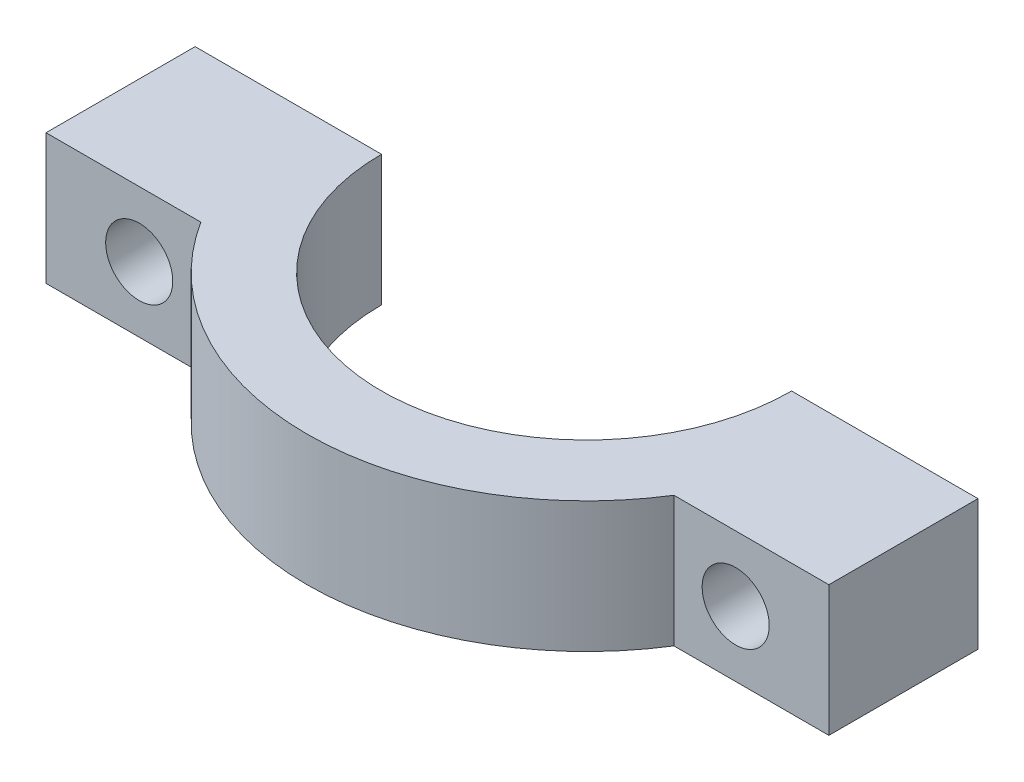
ISO-10303-21;
HEADER;
FILE_DESCRIPTION(('STEP AP214'),'2;1');
FILE_NAME('part.step','',(''),(''),'','','');
FILE_SCHEMA(('AUTOMOTIVE_DESIGN { 1 0 10303 214 1 1 1 1 }'));
ENDSEC;
DATA;
#1=APPLICATION_CONTEXT('core data for automotive mechanical design processes');
#2=APPLICATION_PROTOCOL_DEFINITION('international standard','automotive_design',2000,#1);
#3=PRODUCT_CONTEXT('',#1,'mechanical');
#4=PRODUCT('Part','Part','',(#3));
#5=PRODUCT_RELATED_PRODUCT_CATEGORY('part','',(#4));
#6=PRODUCT_DEFINITION_FORMATION('','',#4);
#7=PRODUCT_DEFINITION_CONTEXT('part definition',#1,'design');
#8=PRODUCT_DEFINITION('design','',#6,#7);
#9=PRODUCT_DEFINITION_SHAPE('','',#8);
#10=(LENGTH_UNIT() NAMED_UNIT(*) SI_UNIT(.MILLI.,.METRE.));
#11=(NAMED_UNIT(*) PLANE_ANGLE_UNIT() SI_UNIT($,.RADIAN.));
#12=(NAMED_UNIT(*) SI_UNIT($,.STERADIAN.) SOLID_ANGLE_UNIT());
#13=UNCERTAINTY_MEASURE_WITH_UNIT(LENGTH_MEASURE(1.E-05),#10,'distance_accuracy_value','');
#14=(GEOMETRIC_REPRESENTATION_CONTEXT(3) GLOBAL_UNCERTAINTY_ASSIGNED_CONTEXT((#13)) GLOBAL_UNIT_ASSIGNED_CONTEXT((#10,
#11,#12)) REPRESENTATION_CONTEXT('',''));
#15=CARTESIAN_POINT('',(0.,0.,0.));
#16=DIRECTION('',(0.,0.,1.));
#17=DIRECTION('',(1.,0.,0.));
#18=AXIS2_PLACEMENT_3D('',#15,#16,#17);
#19=CARTESIAN_POINT('',(0.,7.,0.));
#20=DIRECTION('',(0.,-1.,0.));
#21=DIRECTION('',(0.,0.,-1.));
#22=AXIS2_PLACEMENT_3D('',#19,#20,#21);
#23=CYLINDRICAL_SURFACE('',#22,11.);
#24=CARTESIAN_POINT('',(0.,0.,0.));
#25=DIRECTION('',(0.,-1.,0.));
#26=DIRECTION('',(0.,0.,1.));
#27=AXIS2_PLACEMENT_3D('',#24,#25,#26);
#28=CIRCLE('',#27,11.);
#29=CARTESIAN_POINT('',(11.,0.,0.));
#30=VERTEX_POINT('',#29);
#31=CARTESIAN_POINT('',(-11.,0.,0.));
#32=VERTEX_POINT('',#31);
#33=EDGE_CURVE('E145',#30,#32,#28,.T.);
#34=ORIENTED_EDGE('',*,*,#33,.T.);
#35=DIRECTION('',(0.,-1.,0.));
#36=VECTOR('',#35,1.);
#37=CARTESIAN_POINT('',(-11.,7.,0.));
#38=LINE('',#37,#36);
#39=CARTESIAN_POINT('',(-11.,7.,0.));
#40=VERTEX_POINT('',#39);
#41=EDGE_CURVE('E11',#40,#32,#38,.T.);
#42=ORIENTED_EDGE('',*,*,#41,.F.);
#43=CARTESIAN_POINT('',(0.,7.,0.));
#44=DIRECTION('',(0.,-1.,0.));
#45=DIRECTION('',(0.,0.,1.));
#46=AXIS2_PLACEMENT_3D('',#43,#44,#45);
#47=CIRCLE('',#46,11.);
#48=CARTESIAN_POINT('',(11.,7.,0.));
#49=VERTEX_POINT('',#48);
#50=EDGE_CURVE('E168',#49,#40,#47,.T.);
#51=ORIENTED_EDGE('',*,*,#50,.F.);
#52=DIRECTION('',(0.,-1.,0.));
#53=VECTOR('',#52,1.);
#54=CARTESIAN_POINT('',(11.,7.,0.));
#55=LINE('',#54,#53);
#56=EDGE_CURVE('E141',#49,#30,#55,.T.);
#57=ORIENTED_EDGE('',*,*,#56,.T.);
#58=EDGE_LOOP('',(#34,#42,#51,#57));
#59=FACE_BOUND('',#58,.T.);
#60=ADVANCED_FACE('F43',(#59),#23,.F.);
#61=CARTESIAN_POINT('',(-11.,7.,0.));
#62=DIRECTION('',(0.,0.,1.));
#63=DIRECTION('',(1.,0.,0.));
#64=AXIS2_PLACEMENT_3D('',#61,#62,#63);
#65=PLANE('',#64);
#66=CARTESIAN_POINT('',(-16.,3.5,0.));
#67=DIRECTION('',(0.,0.,1.));
#68=DIRECTION('',(1.,0.,0.));
#69=AXIS2_PLACEMENT_3D('',#66,#67,#68);
#70=CIRCLE('',#69,1.8);
#71=CARTESIAN_POINT('',(-14.2,3.5,0.));
#72=VERTEX_POINT('',#71);
#73=EDGE_CURVE('E220',#72,#72,#70,.T.);
#74=ORIENTED_EDGE('',*,*,#73,.T.);
#75=EDGE_LOOP('',(#74));
#76=FACE_BOUND('',#75,.T.);
#77=DIRECTION('',(-1.,0.,0.));
#78=VECTOR('',#77,1.);
#79=CARTESIAN_POINT('',(-11.,0.,0.));
#80=LINE('',#79,#78);
#81=CARTESIAN_POINT('',(-21.,0.,0.));
#82=VERTEX_POINT('',#81);
#83=EDGE_CURVE('E149',#32,#82,#80,.T.);
#84=ORIENTED_EDGE('',*,*,#83,.T.);
#85=DIRECTION('',(0.,-1.,0.));
#86=VECTOR('',#85,1.);
#87=CARTESIAN_POINT('',(-21.,7.,0.));
#88=LINE('',#87,#86);
#89=CARTESIAN_POINT('',(-21.,7.,0.));
#90=VERTEX_POINT('',#89);
#91=EDGE_CURVE('E53',#90,#82,#88,.T.);
#92=ORIENTED_EDGE('',*,*,#91,.F.);
#93=DIRECTION('',(-1.,0.,0.));
#94=VECTOR('',#93,1.);
#95=CARTESIAN_POINT('',(-11.,7.,0.));
#96=LINE('',#95,#94);
#97=EDGE_CURVE('E104',#40,#90,#96,.T.);
#98=ORIENTED_EDGE('',*,*,#97,.F.);
#99=ORIENTED_EDGE('',*,*,#41,.T.);
#100=EDGE_LOOP('',(#84,#92,#98,#99));
#101=FACE_BOUND('',#100,.T.);
#102=ADVANCED_FACE('F238',(#76,#101),#65,.F.);
#103=CARTESIAN_POINT('',(-21.,7.,0.));
#104=DIRECTION('',(1.,0.,0.));
#105=DIRECTION('',(0.,0.,-1.));
#106=AXIS2_PLACEMENT_3D('',#103,#104,#105);
#107=PLANE('',#106);
#108=DIRECTION('',(0.,0.,1.));
#109=VECTOR('',#108,1.);
#110=CARTESIAN_POINT('',(-21.,0.,0.));
#111=LINE('',#110,#109);
#112=CARTESIAN_POINT('',(-21.,0.,8.));
#113=VERTEX_POINT('',#112);
#114=EDGE_CURVE('E153',#82,#113,#111,.T.);
#115=ORIENTED_EDGE('',*,*,#114,.T.);
#116=DIRECTION('',(0.,-1.,0.));
#117=VECTOR('',#116,1.);
#118=CARTESIAN_POINT('',(-21.,7.,8.));
#119=LINE('',#118,#117);
#120=CARTESIAN_POINT('',(-21.,7.,8.));
#121=VERTEX_POINT('',#120);
#122=EDGE_CURVE('E179',#121,#113,#119,.T.);
#123=ORIENTED_EDGE('',*,*,#122,.F.);
#124=DIRECTION('',(0.,0.,1.));
#125=VECTOR('',#124,1.);
#126=CARTESIAN_POINT('',(-21.,7.,0.));
#127=LINE('',#126,#125);
#128=EDGE_CURVE('E190',#90,#121,#127,.T.);
#129=ORIENTED_EDGE('',*,*,#128,.F.);
#130=ORIENTED_EDGE('',*,*,#91,.T.);
#131=EDGE_LOOP('',(#115,#123,#129,#130));
#132=FACE_BOUND('',#131,.T.);
#133=ADVANCED_FACE('F188',(#132),#107,.F.);
#134=CARTESIAN_POINT('',(-21.,7.,8.));
#135=DIRECTION('',(0.,0.,-1.));
#136=DIRECTION('',(-1.,0.,0.));
#137=AXIS2_PLACEMENT_3D('',#134,#135,#136);
#138=PLANE('',#137);
#139=CARTESIAN_POINT('',(-16.,3.5,8.));
#140=DIRECTION('',(0.,0.,-1.));
#141=DIRECTION('',(-1.,0.,0.));
#142=AXIS2_PLACEMENT_3D('',#139,#140,#141);
#143=CIRCLE('',#142,1.8);
#144=CARTESIAN_POINT('',(-17.8,3.5,8.));
#145=VERTEX_POINT('',#144);
#146=EDGE_CURVE('E46',#145,#145,#143,.F.);
#147=ORIENTED_EDGE('',*,*,#146,.F.);
#148=EDGE_LOOP('',(#147));
#149=FACE_BOUND('',#148,.T.);
#150=DIRECTION('',(1.,0.,0.));
#151=VECTOR('',#150,1.);
#152=CARTESIAN_POINT('',(-21.,0.,8.));
#153=LINE('',#152,#151);
#154=CARTESIAN_POINT('',(-12.6885775404495,0.,8.));
#155=VERTEX_POINT('',#154);
#156=EDGE_CURVE('E156',#113,#155,#153,.T.);
#157=ORIENTED_EDGE('',*,*,#156,.T.);
#158=DIRECTION('',(0.,-1.,0.));
#159=VECTOR('',#158,1.);
#160=CARTESIAN_POINT('',(-12.6885775404495,7.,8.));
#161=LINE('',#160,#159);
#162=CARTESIAN_POINT('',(-12.6885775404495,7.,8.));
#163=VERTEX_POINT('',#162);
#164=EDGE_CURVE('E175',#163,#155,#161,.T.);
#165=ORIENTED_EDGE('',*,*,#164,.F.);
#166=DIRECTION('',(1.,0.,0.));
#167=VECTOR('',#166,1.);
#168=CARTESIAN_POINT('',(-21.,7.,8.));
#169=LINE('',#168,#167);
#170=EDGE_CURVE('E203',#121,#163,#169,.T.);
#171=ORIENTED_EDGE('',*,*,#170,.F.);
#172=ORIENTED_EDGE('',*,*,#122,.T.);
#173=EDGE_LOOP('',(#157,#165,#171,#172));
#174=FACE_BOUND('',#173,.T.);
#175=ADVANCED_FACE('F198',(#149,#174),#138,.F.);
#176=CARTESIAN_POINT('',(0.,7.,0.));
#177=DIRECTION('',(0.,-1.,0.));
#178=DIRECTION('',(0.,0.,-1.));
#179=AXIS2_PLACEMENT_3D('',#176,#177,#178);
#180=CYLINDRICAL_SURFACE('',#179,15.);
#181=CARTESIAN_POINT('',(0.,0.,0.));
#182=DIRECTION('',(0.,1.,0.));
#183=DIRECTION('',(0.,0.,1.));
#184=AXIS2_PLACEMENT_3D('',#181,#182,#183);
#185=CIRCLE('',#184,15.);
#186=CARTESIAN_POINT('',(12.6885775404495,0.,7.99999999999999));
#187=VERTEX_POINT('',#186);
#188=EDGE_CURVE('E159',#155,#187,#185,.T.);
#189=ORIENTED_EDGE('',*,*,#188,.T.);
#190=DIRECTION('',(0.,-1.,0.));
#191=VECTOR('',#190,1.);
#192=CARTESIAN_POINT('',(12.6885775404495,7.,7.99999999999999));
#193=LINE('',#192,#191);
#194=CARTESIAN_POINT('',(12.6885775404495,7.,7.99999999999999));
#195=VERTEX_POINT('',#194);
#196=EDGE_CURVE('E134',#195,#187,#193,.T.);
#197=ORIENTED_EDGE('',*,*,#196,.F.);
#198=CARTESIAN_POINT('',(0.,7.,0.));
#199=DIRECTION('',(0.,1.,0.));
#200=DIRECTION('',(0.,0.,1.));
#201=AXIS2_PLACEMENT_3D('',#198,#199,#200);
#202=CIRCLE('',#201,15.);
#203=EDGE_CURVE('E123',#163,#195,#202,.T.);
#204=ORIENTED_EDGE('',*,*,#203,.F.);
#205=ORIENTED_EDGE('',*,*,#164,.T.);
#206=EDGE_LOOP('',(#189,#197,#204,#205));
#207=FACE_BOUND('',#206,.T.);
#208=ADVANCED_FACE('F201',(#207),#180,.T.);
#209=CARTESIAN_POINT('',(21.,7.,7.99999999999999));
#210=DIRECTION('',(0.,0.,-1.));
#211=DIRECTION('',(-1.,0.,0.));
#212=AXIS2_PLACEMENT_3D('',#209,#210,#211);
#213=PLANE('',#212);
#214=CARTESIAN_POINT('',(16.,3.5,7.99999999999999));
#215=DIRECTION('',(0.,0.,-1.));
#216=DIRECTION('',(-1.,0.,0.));
#217=AXIS2_PLACEMENT_3D('',#214,#215,#216);
#218=CIRCLE('',#217,1.8);
#219=CARTESIAN_POINT('',(14.2,3.5,7.99999999999999));
#220=VERTEX_POINT('',#219);
#221=EDGE_CURVE('E150',#220,#220,#218,.T.);
#222=ORIENTED_EDGE('',*,*,#221,.T.);
#223=EDGE_LOOP('',(#222));
#224=FACE_BOUND('',#223,.T.);
#225=DIRECTION('',(1.,0.,0.));
#226=VECTOR('',#225,1.);
#227=CARTESIAN_POINT('',(21.,0.,7.99999999999999));
#228=LINE('',#227,#226);
#229=CARTESIAN_POINT('',(21.,0.,7.99999999999999));
#230=VERTEX_POINT('',#229);
#231=EDGE_CURVE('E132',#187,#230,#228,.T.);
#232=ORIENTED_EDGE('',*,*,#231,.T.);
#233=DIRECTION('',(0.,-1.,0.));
#234=VECTOR('',#233,1.);
#235=CARTESIAN_POINT('',(21.,7.,7.99999999999999));
#236=LINE('',#235,#234);
#237=CARTESIAN_POINT('',(21.,7.,7.99999999999999));
#238=VERTEX_POINT('',#237);
#239=EDGE_CURVE('E129',#238,#230,#236,.T.);
#240=ORIENTED_EDGE('',*,*,#239,.F.);
#241=DIRECTION('',(1.,0.,0.));
#242=VECTOR('',#241,1.);
#243=CARTESIAN_POINT('',(21.,7.,7.99999999999999));
#244=LINE('',#243,#242);
#245=EDGE_CURVE('E117',#195,#238,#244,.T.);
#246=ORIENTED_EDGE('',*,*,#245,.F.);
#247=ORIENTED_EDGE('',*,*,#196,.T.);
#248=EDGE_LOOP('',(#232,#240,#246,#247));
#249=FACE_BOUND('',#248,.T.);
#250=ADVANCED_FACE('F130',(#224,#249),#213,.F.);
#251=CARTESIAN_POINT('',(21.,7.,0.));
#252=DIRECTION('',(-1.,0.,0.));
#253=DIRECTION('',(0.,0.,1.));
#254=AXIS2_PLACEMENT_3D('',#251,#252,#253);
#255=PLANE('',#254);
#256=DIRECTION('',(0.,0.,-1.));
#257=VECTOR('',#256,1.);
#258=CARTESIAN_POINT('',(21.,0.,0.));
#259=LINE('',#258,#257);
#260=CARTESIAN_POINT('',(21.,0.,0.));
#261=VERTEX_POINT('',#260);
#262=EDGE_CURVE('E90',#230,#261,#259,.T.);
#263=ORIENTED_EDGE('',*,*,#262,.T.);
#264=DIRECTION('',(0.,-1.,0.));
#265=VECTOR('',#264,1.);
#266=CARTESIAN_POINT('',(21.,7.,0.));
#267=LINE('',#266,#265);
#268=CARTESIAN_POINT('',(21.,7.,0.));
#269=VERTEX_POINT('',#268);
#270=EDGE_CURVE('E135',#269,#261,#267,.T.);
#271=ORIENTED_EDGE('',*,*,#270,.F.);
#272=DIRECTION('',(0.,0.,-1.));
#273=VECTOR('',#272,1.);
#274=CARTESIAN_POINT('',(21.,7.,0.));
#275=LINE('',#274,#273);
#276=EDGE_CURVE('E121',#238,#269,#275,.T.);
#277=ORIENTED_EDGE('',*,*,#276,.F.);
#278=ORIENTED_EDGE('',*,*,#239,.T.);
#279=EDGE_LOOP('',(#263,#271,#277,#278));
#280=FACE_BOUND('',#279,.T.);
#281=ADVANCED_FACE('F137',(#280),#255,.F.);
#282=CARTESIAN_POINT('',(11.,7.,0.));
#283=DIRECTION('',(0.,0.,1.));
#284=DIRECTION('',(1.,0.,0.));
#285=AXIS2_PLACEMENT_3D('',#282,#283,#284);
#286=PLANE('',#285);
#287=CARTESIAN_POINT('',(16.,3.5,0.));
#288=DIRECTION('',(0.,0.,-1.));
#289=DIRECTION('',(-1.,0.,0.));
#290=AXIS2_PLACEMENT_3D('',#287,#288,#289);
#291=CIRCLE('',#290,1.8);
#292=CARTESIAN_POINT('',(14.2,3.5,0.));
#293=VERTEX_POINT('',#292);
#294=EDGE_CURVE('E216',#293,#293,#291,.T.);
#295=ORIENTED_EDGE('',*,*,#294,.F.);
#296=EDGE_LOOP('',(#295));
#297=FACE_BOUND('',#296,.T.);
#298=DIRECTION('',(-1.,0.,0.));
#299=VECTOR('',#298,1.);
#300=CARTESIAN_POINT('',(11.,0.,0.));
#301=LINE('',#300,#299);
#302=EDGE_CURVE('E96',#261,#30,#301,.T.);
#303=ORIENTED_EDGE('',*,*,#302,.T.);
#304=ORIENTED_EDGE('',*,*,#56,.F.);
#305=DIRECTION('',(-1.,0.,0.));
#306=VECTOR('',#305,1.);
#307=CARTESIAN_POINT('',(11.,7.,0.));
#308=LINE('',#307,#306);
#309=EDGE_CURVE('E61',#269,#49,#308,.T.);
#310=ORIENTED_EDGE('',*,*,#309,.F.);
#311=ORIENTED_EDGE('',*,*,#270,.T.);
#312=EDGE_LOOP('',(#303,#304,#310,#311));
#313=FACE_BOUND('',#312,.T.);
#314=ADVANCED_FACE('F247',(#297,#313),#286,.F.);
#315=CARTESIAN_POINT('',(0.,7.,0.));
#316=DIRECTION('',(0.,1.,0.));
#317=DIRECTION('',(0.,0.,1.));
#318=AXIS2_PLACEMENT_3D('',#315,#316,#317);
#319=PLANE('',#318);
#320=ORIENTED_EDGE('',*,*,#50,.T.);
#321=ORIENTED_EDGE('',*,*,#97,.T.);
#322=ORIENTED_EDGE('',*,*,#128,.T.);
#323=ORIENTED_EDGE('',*,*,#170,.T.);
#324=ORIENTED_EDGE('',*,*,#203,.T.);
#325=ORIENTED_EDGE('',*,*,#245,.T.);
#326=ORIENTED_EDGE('',*,*,#276,.T.);
#327=ORIENTED_EDGE('',*,*,#309,.T.);
#328=EDGE_LOOP('',(#320,#321,#322,#323,#324,#325,#326,#327));
#329=FACE_BOUND('',#328,.T.);
#330=ADVANCED_FACE('F119',(#329),#319,.T.);
#331=CARTESIAN_POINT('',(0.,0.,0.));
#332=DIRECTION('',(0.,1.,0.));
#333=DIRECTION('',(0.,0.,1.));
#334=AXIS2_PLACEMENT_3D('',#331,#332,#333);
#335=PLANE('',#334);
#336=ORIENTED_EDGE('',*,*,#33,.F.);
#337=ORIENTED_EDGE('',*,*,#302,.F.);
#338=ORIENTED_EDGE('',*,*,#262,.F.);
#339=ORIENTED_EDGE('',*,*,#231,.F.);
#340=ORIENTED_EDGE('',*,*,#188,.F.);
#341=ORIENTED_EDGE('',*,*,#156,.F.);
#342=ORIENTED_EDGE('',*,*,#114,.F.);
#343=ORIENTED_EDGE('',*,*,#83,.F.);
#344=EDGE_LOOP('',(#336,#337,#338,#339,#340,#341,#342,#343));
#345=FACE_BOUND('',#344,.T.);
#346=ADVANCED_FACE('F194',(#345),#335,.F.);
#347=CARTESIAN_POINT('',(16.,3.5,15.));
#348=DIRECTION('',(0.,0.,-1.));
#349=DIRECTION('',(-1.,0.,0.));
#350=AXIS2_PLACEMENT_3D('',#347,#348,#349);
#351=CYLINDRICAL_SURFACE('',#350,1.8);
#352=ORIENTED_EDGE('',*,*,#294,.T.);
#353=EDGE_LOOP('',(#352));
#354=FACE_BOUND('',#353,.T.);
#355=ORIENTED_EDGE('',*,*,#221,.F.);
#356=EDGE_LOOP('',(#355));
#357=FACE_BOUND('',#356,.T.);
#358=ADVANCED_FACE('F266',(#354,#357),#351,.F.);
#359=CARTESIAN_POINT('',(-16.,3.5,15.));
#360=DIRECTION('',(0.,0.,-1.));
#361=DIRECTION('',(-1.,0.,0.));
#362=AXIS2_PLACEMENT_3D('',#359,#360,#361);
#363=CYLINDRICAL_SURFACE('',#362,1.8);
#364=ORIENTED_EDGE('',*,*,#73,.F.);
#365=EDGE_LOOP('',(#364));
#366=FACE_BOUND('',#365,.T.);
#367=ORIENTED_EDGE('',*,*,#146,.T.);
#368=EDGE_LOOP('',(#367));
#369=FACE_BOUND('',#368,.T.);
#370=ADVANCED_FACE('F229',(#366,#369),#363,.F.);
#371=CLOSED_SHELL('',(#60,#102,#133,#175,#208,#250,#281,#314,#330,#346,#358,#370));
#372=MANIFOLD_SOLID_BREP('B2',#371);
#373=ADVANCED_BREP_SHAPE_REPRESENTATION('',(#18,#372),#14);
#374=SHAPE_DEFINITION_REPRESENTATION(#9,#373);
ENDSEC;
END-ISO-10303-21;
